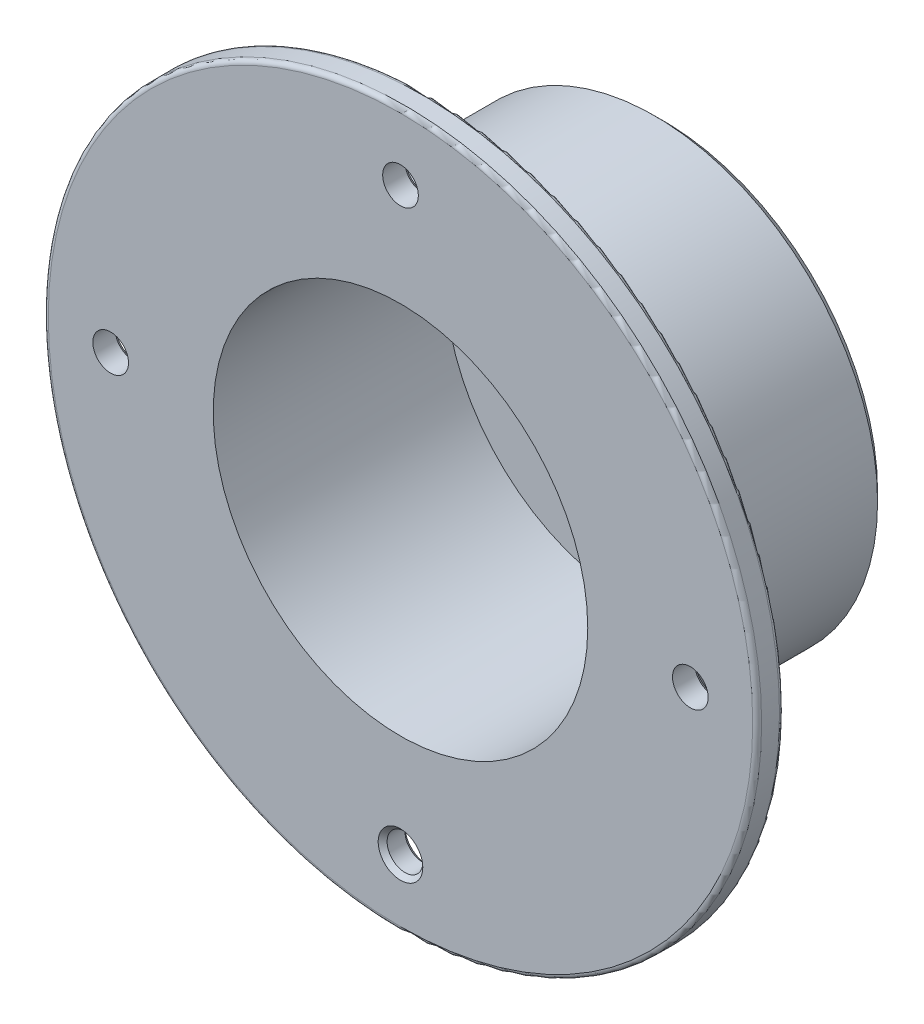
ISO-10303-21;
HEADER;
FILE_DESCRIPTION(('STEP AP214'),'2;1');
FILE_NAME('part.step','',(''),(''),'','','');
FILE_SCHEMA(('AUTOMOTIVE_DESIGN { 1 0 10303 214 1 1 1 1 }'));
ENDSEC;
DATA;
#1=APPLICATION_CONTEXT('core data for automotive mechanical design processes');
#2=APPLICATION_PROTOCOL_DEFINITION('international standard','automotive_design',2000,#1);
#3=PRODUCT_CONTEXT('',#1,'mechanical');
#4=PRODUCT('Part','Part','',(#3));
#5=PRODUCT_RELATED_PRODUCT_CATEGORY('part','',(#4));
#6=PRODUCT_DEFINITION_FORMATION('','',#4);
#7=PRODUCT_DEFINITION_CONTEXT('part definition',#1,'design');
#8=PRODUCT_DEFINITION('design','',#6,#7);
#9=PRODUCT_DEFINITION_SHAPE('','',#8);
#10=(LENGTH_UNIT() NAMED_UNIT(*) SI_UNIT(.MILLI.,.METRE.));
#11=(NAMED_UNIT(*) PLANE_ANGLE_UNIT() SI_UNIT($,.RADIAN.));
#12=(NAMED_UNIT(*) SI_UNIT($,.STERADIAN.) SOLID_ANGLE_UNIT());
#13=UNCERTAINTY_MEASURE_WITH_UNIT(LENGTH_MEASURE(1.E-05),#10,'distance_accuracy_value','');
#14=(GEOMETRIC_REPRESENTATION_CONTEXT(3) GLOBAL_UNCERTAINTY_ASSIGNED_CONTEXT((#13)) GLOBAL_UNIT_ASSIGNED_CONTEXT((#10,
#11,#12)) REPRESENTATION_CONTEXT('',''));
#15=CARTESIAN_POINT('',(0.,0.,0.));
#16=DIRECTION('',(0.,0.,1.));
#17=DIRECTION('',(1.,0.,0.));
#18=AXIS2_PLACEMENT_3D('',#15,#16,#17);
#19=CARTESIAN_POINT('',(0.,0.,29.5));
#20=DIRECTION('',(0.,0.,-1.));
#21=DIRECTION('',(-1.,0.,0.));
#22=AXIS2_PLACEMENT_3D('',#19,#20,#21);
#23=CYLINDRICAL_SURFACE('',#22,25.);
#24=CARTESIAN_POINT('',(0.,0.,25.5));
#25=DIRECTION('',(0.,0.,1.));
#26=DIRECTION('',(1.,0.,0.));
#27=AXIS2_PLACEMENT_3D('',#24,#25,#26);
#28=CIRCLE('',#27,25.);
#29=CARTESIAN_POINT('',(25.,0.,25.5));
#30=VERTEX_POINT('',#29);
#31=EDGE_CURVE('E122',#30,#30,#28,.F.);
#32=ORIENTED_EDGE('',*,*,#31,.T.);
#33=EDGE_LOOP('',(#32));
#34=FACE_BOUND('',#33,.T.);
#35=CARTESIAN_POINT('',(0.,0.,1.));
#36=DIRECTION('',(0.,0.,1.));
#37=DIRECTION('',(1.,0.,0.));
#38=AXIS2_PLACEMENT_3D('',#35,#36,#37);
#39=CIRCLE('',#38,25.);
#40=CARTESIAN_POINT('',(25.,0.,1.));
#41=VERTEX_POINT('',#40);
#42=EDGE_CURVE('E126',#41,#41,#39,.T.);
#43=ORIENTED_EDGE('',*,*,#42,.T.);
#44=EDGE_LOOP('',(#43));
#45=FACE_BOUND('',#44,.T.);
#46=ADVANCED_FACE('F40',(#34,#45),#23,.T.);
#47=CARTESIAN_POINT('',(0.,0.,0.));
#48=DIRECTION('',(0.,0.,1.));
#49=DIRECTION('',(1.,0.,0.));
#50=AXIS2_PLACEMENT_3D('',#47,#48,#49);
#51=PLANE('',#50);
#52=CARTESIAN_POINT('',(0.,0.,0.));
#53=DIRECTION('',(0.,0.,1.));
#54=DIRECTION('',(1.,0.,0.));
#55=AXIS2_PLACEMENT_3D('',#52,#53,#54);
#56=CIRCLE('',#55,24.);
#57=CARTESIAN_POINT('',(24.,0.,0.));
#58=VERTEX_POINT('',#57);
#59=EDGE_CURVE('E118',#58,#58,#56,.F.);
#60=ORIENTED_EDGE('',*,*,#59,.T.);
#61=EDGE_LOOP('',(#60));
#62=FACE_BOUND('',#61,.T.);
#63=ADVANCED_FACE('F170',(#62),#51,.F.);
#64=CARTESIAN_POINT('',(0.,0.,26.5));
#65=DIRECTION('',(0.,0.,1.));
#66=DIRECTION('',(1.,0.,0.));
#67=AXIS2_PLACEMENT_3D('',#64,#65,#66);
#68=CYLINDRICAL_SURFACE('',#67,40.);
#69=CARTESIAN_POINT('',(0.,0.,29.));
#70=DIRECTION('',(0.,0.,1.));
#71=DIRECTION('',(1.,0.,0.));
#72=AXIS2_PLACEMENT_3D('',#69,#70,#71);
#73=CIRCLE('',#72,40.);
#74=CARTESIAN_POINT('',(40.,0.,29.));
#75=VERTEX_POINT('',#74);
#76=EDGE_CURVE('E106',#75,#75,#73,.F.);
#77=ORIENTED_EDGE('',*,*,#76,.T.);
#78=EDGE_LOOP('',(#77));
#79=FACE_BOUND('',#78,.T.);
#80=CARTESIAN_POINT('',(0.,0.,27.));
#81=DIRECTION('',(0.,0.,1.));
#82=DIRECTION('',(1.,0.,0.));
#83=AXIS2_PLACEMENT_3D('',#80,#81,#82);
#84=CIRCLE('',#83,40.);
#85=CARTESIAN_POINT('',(40.,0.,27.));
#86=VERTEX_POINT('',#85);
#87=EDGE_CURVE('E110',#86,#86,#84,.T.);
#88=ORIENTED_EDGE('',*,*,#87,.T.);
#89=EDGE_LOOP('',(#88));
#90=FACE_BOUND('',#89,.T.);
#91=ADVANCED_FACE('F163',(#79,#90),#68,.T.);
#92=CARTESIAN_POINT('',(0.,0.,26.5));
#93=DIRECTION('',(0.,0.,1.));
#94=DIRECTION('',(1.,0.,0.));
#95=AXIS2_PLACEMENT_3D('',#92,#93,#94);
#96=PLANE('',#95);
#97=CARTESIAN_POINT('',(0.,-32.5,26.5));
#98=DIRECTION('',(0.,0.,1.));
#99=DIRECTION('',(1.,0.,0.));
#100=AXIS2_PLACEMENT_3D('',#97,#98,#99);
#101=CIRCLE('',#100,2.50000000000004);
#102=CARTESIAN_POINT('',(2.50000000000004,-32.5,26.5));
#103=VERTEX_POINT('',#102);
#104=EDGE_CURVE('E65',#103,#103,#101,.T.);
#105=ORIENTED_EDGE('',*,*,#104,.T.);
#106=EDGE_LOOP('',(#105));
#107=FACE_BOUND('',#106,.T.);
#108=CARTESIAN_POINT('',(32.5,-1.13779305212189E-13,26.5));
#109=DIRECTION('',(0.,0.,1.));
#110=DIRECTION('',(1.,0.,0.));
#111=AXIS2_PLACEMENT_3D('',#108,#109,#110);
#112=CIRCLE('',#111,2.50000000000004);
#113=CARTESIAN_POINT('',(35.,-1.13779305212189E-13,26.5));
#114=VERTEX_POINT('',#113);
#115=EDGE_CURVE('E69',#114,#114,#112,.T.);
#116=ORIENTED_EDGE('',*,*,#115,.T.);
#117=EDGE_LOOP('',(#116));
#118=FACE_BOUND('',#117,.T.);
#119=CARTESIAN_POINT('',(-32.5,3.40725592236992E-13,26.5));
#120=DIRECTION('',(0.,0.,1.));
#121=DIRECTION('',(1.,0.,0.));
#122=AXIS2_PLACEMENT_3D('',#119,#120,#121);
#123=CIRCLE('',#122,2.50000000000004);
#124=CARTESIAN_POINT('',(-30.,3.40725592236992E-13,26.5));
#125=VERTEX_POINT('',#124);
#126=EDGE_CURVE('E73',#125,#125,#123,.T.);
#127=ORIENTED_EDGE('',*,*,#126,.T.);
#128=EDGE_LOOP('',(#127));
#129=FACE_BOUND('',#128,.T.);
#130=CARTESIAN_POINT('',(0.,32.5,26.5));
#131=DIRECTION('',(0.,0.,1.));
#132=DIRECTION('',(1.,0.,0.));
#133=AXIS2_PLACEMENT_3D('',#130,#131,#132);
#134=CIRCLE('',#133,2.50000000000004);
#135=CARTESIAN_POINT('',(2.50000000000004,32.5,26.5));
#136=VERTEX_POINT('',#135);
#137=EDGE_CURVE('E77',#136,#136,#134,.T.);
#138=ORIENTED_EDGE('',*,*,#137,.T.);
#139=EDGE_LOOP('',(#138));
#140=FACE_BOUND('',#139,.T.);
#141=CARTESIAN_POINT('',(0.,0.,26.5));
#142=DIRECTION('',(0.,0.,1.));
#143=DIRECTION('',(1.,0.,0.));
#144=AXIS2_PLACEMENT_3D('',#141,#142,#143);
#145=CIRCLE('',#144,39.5);
#146=CARTESIAN_POINT('',(39.5,0.,26.5));
#147=VERTEX_POINT('',#146);
#148=EDGE_CURVE('E89',#147,#147,#145,.F.);
#149=ORIENTED_EDGE('',*,*,#148,.T.);
#150=EDGE_LOOP('',(#149));
#151=FACE_BOUND('',#150,.T.);
#152=CARTESIAN_POINT('',(0.,0.,26.5));
#153=DIRECTION('',(0.,0.,1.));
#154=DIRECTION('',(1.,0.,0.));
#155=AXIS2_PLACEMENT_3D('',#152,#153,#154);
#156=CIRCLE('',#155,26.);
#157=CARTESIAN_POINT('',(26.,0.,26.5));
#158=VERTEX_POINT('',#157);
#159=EDGE_CURVE('E130',#158,#158,#156,.T.);
#160=ORIENTED_EDGE('',*,*,#159,.T.);
#161=EDGE_LOOP('',(#160));
#162=FACE_BOUND('',#161,.T.);
#163=ADVANCED_FACE('F154',(#107,#118,#129,#140,#151,#162),#96,.F.);
#164=CARTESIAN_POINT('',(0.,0.,29.5));
#165=DIRECTION('',(0.,0.,1.));
#166=DIRECTION('',(1.,0.,0.));
#167=AXIS2_PLACEMENT_3D('',#164,#165,#166);
#168=PLANE('',#167);
#169=CARTESIAN_POINT('',(0.,-32.5,29.5));
#170=DIRECTION('',(0.,0.,1.));
#171=DIRECTION('',(1.,0.,0.));
#172=AXIS2_PLACEMENT_3D('',#169,#170,#171);
#173=CIRCLE('',#172,2.50000000000004);
#174=CARTESIAN_POINT('',(2.50000000000004,-32.5,29.5));
#175=VERTEX_POINT('',#174);
#176=EDGE_CURVE('E59',#175,#175,#173,.F.);
#177=ORIENTED_EDGE('',*,*,#176,.T.);
#178=EDGE_LOOP('',(#177));
#179=FACE_BOUND('',#178,.T.);
#180=CARTESIAN_POINT('',(32.5,-1.13779305212189E-13,29.5));
#181=DIRECTION('',(0.,0.,1.));
#182=DIRECTION('',(1.,0.,0.));
#183=AXIS2_PLACEMENT_3D('',#180,#181,#182);
#184=CIRCLE('',#183,2.);
#185=CARTESIAN_POINT('',(30.5,-1.13779305212189E-13,29.5));
#186=VERTEX_POINT('',#185);
#187=EDGE_CURVE('E90',#186,#186,#184,.T.);
#188=ORIENTED_EDGE('',*,*,#187,.F.);
#189=EDGE_LOOP('',(#188));
#190=FACE_BOUND('',#189,.T.);
#191=CARTESIAN_POINT('',(-32.5,3.40725592236992E-13,29.5));
#192=DIRECTION('',(0.,0.,1.));
#193=DIRECTION('',(1.,0.,0.));
#194=AXIS2_PLACEMENT_3D('',#191,#192,#193);
#195=CIRCLE('',#194,2.);
#196=CARTESIAN_POINT('',(-34.5,3.40725592236992E-13,29.5));
#197=VERTEX_POINT('',#196);
#198=EDGE_CURVE('E95',#197,#197,#195,.T.);
#199=ORIENTED_EDGE('',*,*,#198,.F.);
#200=EDGE_LOOP('',(#199));
#201=FACE_BOUND('',#200,.T.);
#202=CARTESIAN_POINT('',(0.,32.5,29.5));
#203=DIRECTION('',(0.,0.,1.));
#204=DIRECTION('',(1.,0.,0.));
#205=AXIS2_PLACEMENT_3D('',#202,#203,#204);
#206=CIRCLE('',#205,2.);
#207=CARTESIAN_POINT('',(-2.,32.5,29.5));
#208=VERTEX_POINT('',#207);
#209=EDGE_CURVE('E94',#208,#208,#206,.T.);
#210=ORIENTED_EDGE('',*,*,#209,.F.);
#211=EDGE_LOOP('',(#210));
#212=FACE_BOUND('',#211,.T.);
#213=CARTESIAN_POINT('',(0.,0.,29.5));
#214=DIRECTION('',(0.,0.,1.));
#215=DIRECTION('',(1.,0.,0.));
#216=AXIS2_PLACEMENT_3D('',#213,#214,#215);
#217=CIRCLE('',#216,39.5);
#218=CARTESIAN_POINT('',(39.5,0.,29.5));
#219=VERTEX_POINT('',#218);
#220=EDGE_CURVE('E114',#219,#219,#217,.T.);
#221=ORIENTED_EDGE('',*,*,#220,.T.);
#222=EDGE_LOOP('',(#221));
#223=FACE_BOUND('',#222,.T.);
#224=CARTESIAN_POINT('',(0.,0.,29.5));
#225=DIRECTION('',(0.,0.,1.));
#226=DIRECTION('',(1.,0.,0.));
#227=AXIS2_PLACEMENT_3D('',#224,#225,#226);
#228=CIRCLE('',#227,21.);
#229=CARTESIAN_POINT('',(21.,0.,29.5));
#230=VERTEX_POINT('',#229);
#231=EDGE_CURVE('E102',#230,#230,#228,.T.);
#232=ORIENTED_EDGE('',*,*,#231,.F.);
#233=EDGE_LOOP('',(#232));
#234=FACE_BOUND('',#233,.T.);
#235=ADVANCED_FACE('F151',(#179,#190,#201,#212,#223,#234),#168,.T.);
#236=CARTESIAN_POINT('',(0.,0.,26.5));
#237=DIRECTION('',(0.,0.,1.));
#238=DIRECTION('',(1.,0.,0.));
#239=AXIS2_PLACEMENT_3D('',#236,#237,#238);
#240=CONICAL_SURFACE('',#239,26.,0.78539816339745);
#241=ORIENTED_EDGE('',*,*,#31,.F.);
#242=EDGE_LOOP('',(#241));
#243=FACE_BOUND('',#242,.T.);
#244=ORIENTED_EDGE('',*,*,#159,.F.);
#245=EDGE_LOOP('',(#244));
#246=FACE_BOUND('',#245,.T.);
#247=ADVANCED_FACE('F153',(#243,#246),#240,.T.);
#248=CARTESIAN_POINT('',(0.,0.,1.));
#249=DIRECTION('',(0.,0.,1.));
#250=DIRECTION('',(1.,0.,0.));
#251=AXIS2_PLACEMENT_3D('',#248,#249,#250);
#252=CONICAL_SURFACE('',#251,25.,0.785398163397447);
#253=ORIENTED_EDGE('',*,*,#59,.F.);
#254=EDGE_LOOP('',(#253));
#255=FACE_BOUND('',#254,.T.);
#256=ORIENTED_EDGE('',*,*,#42,.F.);
#257=EDGE_LOOP('',(#256));
#258=FACE_BOUND('',#257,.T.);
#259=ADVANCED_FACE('F147',(#255,#258),#252,.T.);
#260=CARTESIAN_POINT('',(0.,0.,3.5));
#261=DIRECTION('',(0.,0.,1.));
#262=DIRECTION('',(1.,0.,0.));
#263=AXIS2_PLACEMENT_3D('',#260,#261,#262);
#264=CYLINDRICAL_SURFACE('',#263,21.);
#265=CARTESIAN_POINT('',(0.,0.,3.5));
#266=DIRECTION('',(0.,0.,1.));
#267=DIRECTION('',(1.,0.,0.));
#268=AXIS2_PLACEMENT_3D('',#265,#266,#267);
#269=CIRCLE('',#268,21.);
#270=CARTESIAN_POINT('',(21.,0.,3.5));
#271=VERTEX_POINT('',#270);
#272=EDGE_CURVE('E134',#271,#271,#269,.T.);
#273=CARTESIAN_POINT('',(21.,0.,3.5));
#274=CARTESIAN_POINT('',(21.,0.,3.77083333333333));
#275=CARTESIAN_POINT('',(21.,0.,4.04166666666667));
#276=CARTESIAN_POINT('',(21.,0.,4.58333333333333));
#277=CARTESIAN_POINT('',(21.,0.,4.85416666666667));
#278=CARTESIAN_POINT('',(21.,0.,5.39583333333333));
#279=CARTESIAN_POINT('',(21.,0.,5.66666666666667));
#280=CARTESIAN_POINT('',(21.,0.,6.20833333333333));
#281=CARTESIAN_POINT('',(21.,0.,6.47916666666667));
#282=CARTESIAN_POINT('',(21.,0.,7.02083333333333));
#283=CARTESIAN_POINT('',(21.,0.,7.29166666666667));
#284=CARTESIAN_POINT('',(21.,0.,7.83333333333333));
#285=CARTESIAN_POINT('',(21.,0.,8.10416666666667));
#286=CARTESIAN_POINT('',(21.,0.,8.64583333333333));
#287=CARTESIAN_POINT('',(21.,0.,8.91666666666667));
#288=CARTESIAN_POINT('',(21.,0.,9.45833333333333));
#289=CARTESIAN_POINT('',(21.,0.,9.72916666666667));
#290=CARTESIAN_POINT('',(21.,0.,10.2708333333333));
#291=CARTESIAN_POINT('',(21.,0.,10.5416666666667));
#292=CARTESIAN_POINT('',(21.,0.,11.0833333333333));
#293=CARTESIAN_POINT('',(21.,0.,11.3541666666667));
#294=CARTESIAN_POINT('',(21.,0.,11.8958333333333));
#295=CARTESIAN_POINT('',(21.,0.,12.1666666666667));
#296=CARTESIAN_POINT('',(21.,0.,12.7083333333333));
#297=CARTESIAN_POINT('',(21.,0.,12.9791666666667));
#298=CARTESIAN_POINT('',(21.,0.,13.5208333333333));
#299=CARTESIAN_POINT('',(21.,0.,13.7916666666667));
#300=CARTESIAN_POINT('',(21.,0.,14.3333333333333));
#301=CARTESIAN_POINT('',(21.,0.,14.6041666666667));
#302=CARTESIAN_POINT('',(21.,0.,15.1458333333333));
#303=CARTESIAN_POINT('',(21.,0.,15.4166666666667));
#304=CARTESIAN_POINT('',(21.,0.,15.9583333333333));
#305=CARTESIAN_POINT('',(21.,0.,16.2291666666667));
#306=CARTESIAN_POINT('',(21.,0.,16.7708333333333));
#307=CARTESIAN_POINT('',(21.,0.,17.0416666666667));
#308=CARTESIAN_POINT('',(21.,0.,17.5833333333333));
#309=CARTESIAN_POINT('',(21.,0.,17.8541666666667));
#310=CARTESIAN_POINT('',(21.,0.,18.3958333333333));
#311=CARTESIAN_POINT('',(21.,0.,18.6666666666667));
#312=CARTESIAN_POINT('',(21.,0.,19.2083333333333));
#313=CARTESIAN_POINT('',(21.,0.,19.4791666666667));
#314=CARTESIAN_POINT('',(21.,0.,20.0208333333333));
#315=CARTESIAN_POINT('',(21.,0.,20.2916666666667));
#316=CARTESIAN_POINT('',(21.,0.,20.8333333333333));
#317=CARTESIAN_POINT('',(21.,0.,21.1041666666667));
#318=CARTESIAN_POINT('',(21.,0.,21.6458333333333));
#319=CARTESIAN_POINT('',(21.,0.,21.9166666666667));
#320=CARTESIAN_POINT('',(21.,0.,22.4583333333333));
#321=CARTESIAN_POINT('',(21.,0.,22.7291666666667));
#322=CARTESIAN_POINT('',(21.,0.,23.2708333333333));
#323=CARTESIAN_POINT('',(21.,0.,23.5416666666667));
#324=CARTESIAN_POINT('',(21.,0.,24.0833333333333));
#325=CARTESIAN_POINT('',(21.,0.,24.3541666666667));
#326=CARTESIAN_POINT('',(21.,0.,24.8958333333333));
#327=CARTESIAN_POINT('',(21.,0.,25.1666666666667));
#328=CARTESIAN_POINT('',(21.,0.,25.7083333333333));
#329=CARTESIAN_POINT('',(21.,0.,25.9791666666667));
#330=CARTESIAN_POINT('',(21.,0.,26.5208333333333));
#331=CARTESIAN_POINT('',(21.,0.,26.7916666666667));
#332=CARTESIAN_POINT('',(21.,0.,27.3333333333333));
#333=CARTESIAN_POINT('',(21.,0.,27.6041666666667));
#334=CARTESIAN_POINT('',(21.,0.,28.1458333333333));
#335=CARTESIAN_POINT('',(21.,0.,28.4166666666667));
#336=CARTESIAN_POINT('',(21.,0.,28.9583333333333));
#337=CARTESIAN_POINT('',(21.,0.,29.2291666666667));
#338=CARTESIAN_POINT('',(21.,0.,29.5));
#339=B_SPLINE_CURVE_WITH_KNOTS('',3,(#273,#274,#275,#276,#277,#278,#279,#280,#281,#282,#283,
#284,#285,#286,#287,#288,#289,#290,#291,#292,#293,#294,#295,#296,#297,#298,#299,#300,#301,#302,
#303,#304,#305,#306,#307,#308,#309,#310,#311,#312,#313,#314,#315,#316,#317,#318,#319,#320,#321,
#322,#323,#324,#325,#326,#327,#328,#329,#330,#331,#332,#333,#334,#335,#336,#337,#338),
.UNSPECIFIED.,.F.,.F.,(4,2,2,2,2,2,2,2,2,2,2,2,2,2,2,2,2,2,2,2,2,2,2,2,2,2,2,2,2,2,2,2,4),(0.,
0.8125,1.625,2.4375,3.25,4.0625,4.875,5.6875,6.5,7.3125,8.125,8.9375,9.75,10.5625,11.375,
12.1875,13.,13.8125,14.625,15.4375,16.25,17.0625,17.875,18.6875,19.5,20.3125,21.125,21.9375,
22.75,23.5625,24.375,25.1875,26.),.UNSPECIFIED.);
#340=EDGE_CURVE('BSEAM144',#271,#230,#339,.T.);
#341=ORIENTED_EDGE('',*,*,#272,.F.);
#342=ORIENTED_EDGE('',*,*,#231,.T.);
#343=ORIENTED_EDGE('',*,*,#340,.T.);
#344=ORIENTED_EDGE('',*,*,#340,.F.);
#345=EDGE_LOOP('',(#341,#343,#342,#344));
#346=FACE_BOUND('',#345,.T.);
#347=ADVANCED_FACE('F144',(#346),#264,.F.);
#348=CARTESIAN_POINT('',(0.,0.,3.5));
#349=DIRECTION('',(0.,0.,1.));
#350=DIRECTION('',(1.,0.,0.));
#351=AXIS2_PLACEMENT_3D('',#348,#349,#350);
#352=PLANE('',#351);
#353=ORIENTED_EDGE('',*,*,#272,.T.);
#354=EDGE_LOOP('',(#353));
#355=FACE_BOUND('',#354,.T.);
#356=ADVANCED_FACE('F142',(#355),#352,.T.);
#357=CARTESIAN_POINT('',(0.,0.,29.));
#358=DIRECTION('',(0.,0.,1.));
#359=DIRECTION('',(1.,0.,0.));
#360=AXIS2_PLACEMENT_3D('',#357,#358,#359);
#361=TOROIDAL_SURFACE('',#360,39.5,0.5);
#362=ORIENTED_EDGE('',*,*,#76,.F.);
#363=EDGE_LOOP('',(#362));
#364=FACE_BOUND('',#363,.T.);
#365=ORIENTED_EDGE('',*,*,#220,.F.);
#366=EDGE_LOOP('',(#365));
#367=FACE_BOUND('',#366,.T.);
#368=ADVANCED_FACE('F189',(#364,#367),#361,.T.);
#369=CARTESIAN_POINT('',(0.,0.,27.));
#370=DIRECTION('',(0.,0.,1.));
#371=DIRECTION('',(1.,0.,0.));
#372=AXIS2_PLACEMENT_3D('',#369,#370,#371);
#373=TOROIDAL_SURFACE('',#372,39.5,0.5);
#374=ORIENTED_EDGE('',*,*,#148,.F.);
#375=EDGE_LOOP('',(#374));
#376=FACE_BOUND('',#375,.T.);
#377=ORIENTED_EDGE('',*,*,#87,.F.);
#378=EDGE_LOOP('',(#377));
#379=FACE_BOUND('',#378,.T.);
#380=ADVANCED_FACE('F192',(#376,#379),#373,.T.);
#381=CARTESIAN_POINT('',(0.,32.5,52.5));
#382=DIRECTION('',(0.,0.,-1.));
#383=DIRECTION('',(-1.,0.,0.));
#384=AXIS2_PLACEMENT_3D('',#381,#382,#383);
#385=CYLINDRICAL_SURFACE('',#384,2.);
#386=CARTESIAN_POINT('',(0.,32.5,27.));
#387=DIRECTION('',(0.,0.,1.));
#388=DIRECTION('',(1.,0.,0.));
#389=AXIS2_PLACEMENT_3D('',#386,#387,#388);
#390=CIRCLE('',#389,2.);
#391=CARTESIAN_POINT('',(-2.,32.5,27.));
#392=VERTEX_POINT('',#391);
#393=EDGE_CURVE('E10',#392,#392,#390,.F.);
#394=CARTESIAN_POINT('',(-2.,32.5,27.));
#395=CARTESIAN_POINT('',(-2.,32.5,27.0260416666667));
#396=CARTESIAN_POINT('',(-2.,32.5,27.0520833333334));
#397=CARTESIAN_POINT('',(-2.,32.5,27.1041666666667));
#398=CARTESIAN_POINT('',(-2.,32.5,27.1302083333334));
#399=CARTESIAN_POINT('',(-2.,32.5,27.1822916666667));
#400=CARTESIAN_POINT('',(-2.,32.5,27.2083333333334));
#401=CARTESIAN_POINT('',(-2.,32.5,27.2604166666667));
#402=CARTESIAN_POINT('',(-2.,32.5,27.2864583333334));
#403=CARTESIAN_POINT('',(-2.,32.5,27.3385416666667));
#404=CARTESIAN_POINT('',(-2.,32.5,27.3645833333334));
#405=CARTESIAN_POINT('',(-2.,32.5,27.4166666666667));
#406=CARTESIAN_POINT('',(-2.,32.5,27.4427083333334));
#407=CARTESIAN_POINT('',(-2.,32.5,27.4947916666667));
#408=CARTESIAN_POINT('',(-2.,32.5,27.5208333333334));
#409=CARTESIAN_POINT('',(-2.,32.5,27.5729166666667));
#410=CARTESIAN_POINT('',(-2.,32.5,27.5989583333334));
#411=CARTESIAN_POINT('',(-2.,32.5,27.6510416666667));
#412=CARTESIAN_POINT('',(-2.,32.5,27.6770833333334));
#413=CARTESIAN_POINT('',(-2.,32.5,27.7291666666667));
#414=CARTESIAN_POINT('',(-2.,32.5,27.7552083333334));
#415=CARTESIAN_POINT('',(-2.,32.5,27.8072916666667));
#416=CARTESIAN_POINT('',(-2.,32.5,27.8333333333334));
#417=CARTESIAN_POINT('',(-2.,32.5,27.8854166666667));
#418=CARTESIAN_POINT('',(-2.,32.5,27.9114583333334));
#419=CARTESIAN_POINT('',(-2.,32.5,27.9635416666667));
#420=CARTESIAN_POINT('',(-2.,32.5,27.9895833333334));
#421=CARTESIAN_POINT('',(-2.,32.5,28.0416666666667));
#422=CARTESIAN_POINT('',(-2.,32.5,28.0677083333333));
#423=CARTESIAN_POINT('',(-2.,32.5,28.1197916666667));
#424=CARTESIAN_POINT('',(-2.,32.5,28.1458333333333));
#425=CARTESIAN_POINT('',(-2.,32.5,28.1979166666667));
#426=CARTESIAN_POINT('',(-2.,32.5,28.2239583333333));
#427=CARTESIAN_POINT('',(-2.,32.5,28.2760416666667));
#428=CARTESIAN_POINT('',(-2.,32.5,28.3020833333333));
#429=CARTESIAN_POINT('',(-2.,32.5,28.3541666666667));
#430=CARTESIAN_POINT('',(-2.,32.5,28.3802083333333));
#431=CARTESIAN_POINT('',(-2.,32.5,28.4322916666667));
#432=CARTESIAN_POINT('',(-2.,32.5,28.4583333333333));
#433=CARTESIAN_POINT('',(-2.,32.5,28.5104166666667));
#434=CARTESIAN_POINT('',(-2.,32.5,28.5364583333333));
#435=CARTESIAN_POINT('',(-2.,32.5,28.5885416666667));
#436=CARTESIAN_POINT('',(-2.,32.5,28.6145833333333));
#437=CARTESIAN_POINT('',(-2.,32.5,28.6666666666667));
#438=CARTESIAN_POINT('',(-2.,32.5,28.6927083333333));
#439=CARTESIAN_POINT('',(-2.,32.5,28.7447916666667));
#440=CARTESIAN_POINT('',(-2.,32.5,28.7708333333333));
#441=CARTESIAN_POINT('',(-2.,32.5,28.8229166666667));
#442=CARTESIAN_POINT('',(-2.,32.5,28.8489583333333));
#443=CARTESIAN_POINT('',(-2.,32.5,28.9010416666667));
#444=CARTESIAN_POINT('',(-2.,32.5,28.9270833333333));
#445=CARTESIAN_POINT('',(-2.,32.5,28.9791666666667));
#446=CARTESIAN_POINT('',(-2.,32.5,29.0052083333333));
#447=CARTESIAN_POINT('',(-2.,32.5,29.0572916666667));
#448=CARTESIAN_POINT('',(-2.,32.5,29.0833333333333));
#449=CARTESIAN_POINT('',(-2.,32.5,29.1354166666667));
#450=CARTESIAN_POINT('',(-2.,32.5,29.1614583333333));
#451=CARTESIAN_POINT('',(-2.,32.5,29.2135416666667));
#452=CARTESIAN_POINT('',(-2.,32.5,29.2395833333333));
#453=CARTESIAN_POINT('',(-2.,32.5,29.2916666666667));
#454=CARTESIAN_POINT('',(-2.,32.5,29.3177083333333));
#455=CARTESIAN_POINT('',(-2.,32.5,29.3697916666667));
#456=CARTESIAN_POINT('',(-2.,32.5,29.3958333333333));
#457=CARTESIAN_POINT('',(-2.,32.5,29.4479166666667));
#458=CARTESIAN_POINT('',(-2.,32.5,29.4739583333333));
#459=CARTESIAN_POINT('',(-2.,32.5,29.5));
#460=B_SPLINE_CURVE_WITH_KNOTS('',3,(#394,#395,#396,#397,#398,#399,#400,#401,#402,#403,#404,
#405,#406,#407,#408,#409,#410,#411,#412,#413,#414,#415,#416,#417,#418,#419,#420,#421,#422,#423,
#424,#425,#426,#427,#428,#429,#430,#431,#432,#433,#434,#435,#436,#437,#438,#439,#440,#441,#442,
#443,#444,#445,#446,#447,#448,#449,#450,#451,#452,#453,#454,#455,#456,#457,#458,#459),
.UNSPECIFIED.,.F.,.F.,(4,2,2,2,2,2,2,2,2,2,2,2,2,2,2,2,2,2,2,2,2,2,2,2,2,2,2,2,2,2,2,2,4),(0.,
0.0781249999999983,0.156249999999997,0.234374999999995,0.312499999999993,0.390624999999995,
0.468749999999993,0.546874999999992,0.62499999999999,0.703124999999988,0.781249999999987,
0.859374999999985,0.937499999999987,1.01562499999999,1.09374999999998,1.17187499999998,
1.24999999999998,1.32812499999998,1.40624999999998,1.48437499999998,1.56249999999997,
1.64062499999998,1.71874999999997,1.79687499999997,1.87499999999997,1.95312499999997,
2.03124999999997,2.10937499999997,2.18749999999997,2.26562499999997,2.34374999999996,
2.42187499999996,2.49999999999996),.UNSPECIFIED.);
#461=EDGE_CURVE('BSEAM196',#392,#208,#460,.T.);
#462=ORIENTED_EDGE('',*,*,#393,.T.);
#463=ORIENTED_EDGE('',*,*,#209,.T.);
#464=ORIENTED_EDGE('',*,*,#461,.T.);
#465=ORIENTED_EDGE('',*,*,#461,.F.);
#466=EDGE_LOOP('',(#462,#464,#463,#465));
#467=FACE_BOUND('',#466,.T.);
#468=ADVANCED_FACE('F196',(#467),#385,.F.);
#469=CARTESIAN_POINT('',(-32.5,3.40725592236992E-13,52.5));
#470=DIRECTION('',(0.,0.,-1.));
#471=DIRECTION('',(-1.,0.,0.));
#472=AXIS2_PLACEMENT_3D('',#469,#470,#471);
#473=CYLINDRICAL_SURFACE('',#472,2.);
#474=CARTESIAN_POINT('',(-32.5,3.40725592236992E-13,27.));
#475=DIRECTION('',(0.,0.,1.));
#476=DIRECTION('',(1.,0.,0.));
#477=AXIS2_PLACEMENT_3D('',#474,#475,#476);
#478=CIRCLE('',#477,2.);
#479=CARTESIAN_POINT('',(-34.5,3.40725592236992E-13,27.));
#480=VERTEX_POINT('',#479);
#481=EDGE_CURVE('E49',#480,#480,#478,.F.);
#482=CARTESIAN_POINT('',(-34.5,3.40725592236992E-13,27.));
#483=CARTESIAN_POINT('',(-34.5,3.40725592236992E-13,27.0260416666667));
#484=CARTESIAN_POINT('',(-34.5,3.40725592236992E-13,27.0520833333334));
#485=CARTESIAN_POINT('',(-34.5,3.40725592236992E-13,27.1041666666667));
#486=CARTESIAN_POINT('',(-34.5,3.40725592236992E-13,27.1302083333334));
#487=CARTESIAN_POINT('',(-34.5,3.40725592236992E-13,27.1822916666667));
#488=CARTESIAN_POINT('',(-34.5,3.40725592236992E-13,27.2083333333334));
#489=CARTESIAN_POINT('',(-34.5,3.40725592236992E-13,27.2604166666667));
#490=CARTESIAN_POINT('',(-34.5,3.40725592236992E-13,27.2864583333334));
#491=CARTESIAN_POINT('',(-34.5,3.40725592236992E-13,27.3385416666667));
#492=CARTESIAN_POINT('',(-34.5,3.40725592236992E-13,27.3645833333334));
#493=CARTESIAN_POINT('',(-34.5,3.40725592236992E-13,27.4166666666667));
#494=CARTESIAN_POINT('',(-34.5,3.40725592236992E-13,27.4427083333334));
#495=CARTESIAN_POINT('',(-34.5,3.40725592236992E-13,27.4947916666667));
#496=CARTESIAN_POINT('',(-34.5,3.40725592236992E-13,27.5208333333334));
#497=CARTESIAN_POINT('',(-34.5,3.40725592236992E-13,27.5729166666667));
#498=CARTESIAN_POINT('',(-34.5,3.40725592236992E-13,27.5989583333334));
#499=CARTESIAN_POINT('',(-34.5,3.40725592236992E-13,27.6510416666667));
#500=CARTESIAN_POINT('',(-34.5,3.40725592236992E-13,27.6770833333334));
#501=CARTESIAN_POINT('',(-34.5,3.40725592236992E-13,27.7291666666667));
#502=CARTESIAN_POINT('',(-34.5,3.40725592236992E-13,27.7552083333334));
#503=CARTESIAN_POINT('',(-34.5,3.40725592236992E-13,27.8072916666667));
#504=CARTESIAN_POINT('',(-34.5,3.40725592236992E-13,27.8333333333334));
#505=CARTESIAN_POINT('',(-34.5,3.40725592236992E-13,27.8854166666667));
#506=CARTESIAN_POINT('',(-34.5,3.40725592236992E-13,27.9114583333334));
#507=CARTESIAN_POINT('',(-34.5,3.40725592236992E-13,27.9635416666667));
#508=CARTESIAN_POINT('',(-34.5,3.40725592236992E-13,27.9895833333334));
#509=CARTESIAN_POINT('',(-34.5,3.40725592236992E-13,28.0416666666667));
#510=CARTESIAN_POINT('',(-34.5,3.40725592236992E-13,28.0677083333333));
#511=CARTESIAN_POINT('',(-34.5,3.40725592236992E-13,28.1197916666667));
#512=CARTESIAN_POINT('',(-34.5,3.40725592236992E-13,28.1458333333333));
#513=CARTESIAN_POINT('',(-34.5,3.40725592236992E-13,28.1979166666667));
#514=CARTESIAN_POINT('',(-34.5,3.40725592236992E-13,28.2239583333333));
#515=CARTESIAN_POINT('',(-34.5,3.40725592236992E-13,28.2760416666667));
#516=CARTESIAN_POINT('',(-34.5,3.40725592236992E-13,28.3020833333333));
#517=CARTESIAN_POINT('',(-34.5,3.40725592236992E-13,28.3541666666667));
#518=CARTESIAN_POINT('',(-34.5,3.40725592236992E-13,28.3802083333333));
#519=CARTESIAN_POINT('',(-34.5,3.40725592236992E-13,28.4322916666667));
#520=CARTESIAN_POINT('',(-34.5,3.40725592236992E-13,28.4583333333333));
#521=CARTESIAN_POINT('',(-34.5,3.40725592236992E-13,28.5104166666667));
#522=CARTESIAN_POINT('',(-34.5,3.40725592236992E-13,28.5364583333333));
#523=CARTESIAN_POINT('',(-34.5,3.40725592236992E-13,28.5885416666667));
#524=CARTESIAN_POINT('',(-34.5,3.40725592236992E-13,28.6145833333333));
#525=CARTESIAN_POINT('',(-34.5,3.40725592236992E-13,28.6666666666667));
#526=CARTESIAN_POINT('',(-34.5,3.40725592236992E-13,28.6927083333333));
#527=CARTESIAN_POINT('',(-34.5,3.40725592236992E-13,28.7447916666667));
#528=CARTESIAN_POINT('',(-34.5,3.40725592236992E-13,28.7708333333333));
#529=CARTESIAN_POINT('',(-34.5,3.40725592236992E-13,28.8229166666667));
#530=CARTESIAN_POINT('',(-34.5,3.40725592236992E-13,28.8489583333333));
#531=CARTESIAN_POINT('',(-34.5,3.40725592236992E-13,28.9010416666667));
#532=CARTESIAN_POINT('',(-34.5,3.40725592236992E-13,28.9270833333333));
#533=CARTESIAN_POINT('',(-34.5,3.40725592236992E-13,28.9791666666667));
#534=CARTESIAN_POINT('',(-34.5,3.40725592236992E-13,29.0052083333333));
#535=CARTESIAN_POINT('',(-34.5,3.40725592236992E-13,29.0572916666667));
#536=CARTESIAN_POINT('',(-34.5,3.40725592236992E-13,29.0833333333333));
#537=CARTESIAN_POINT('',(-34.5,3.40725592236992E-13,29.1354166666667));
#538=CARTESIAN_POINT('',(-34.5,3.40725592236992E-13,29.1614583333333));
#539=CARTESIAN_POINT('',(-34.5,3.40725592236992E-13,29.2135416666667));
#540=CARTESIAN_POINT('',(-34.5,3.40725592236992E-13,29.2395833333333));
#541=CARTESIAN_POINT('',(-34.5,3.40725592236992E-13,29.2916666666667));
#542=CARTESIAN_POINT('',(-34.5,3.40725592236992E-13,29.3177083333333));
#543=CARTESIAN_POINT('',(-34.5,3.40725592236992E-13,29.3697916666667));
#544=CARTESIAN_POINT('',(-34.5,3.40725592236992E-13,29.3958333333333));
#545=CARTESIAN_POINT('',(-34.5,3.40725592236992E-13,29.4479166666667));
#546=CARTESIAN_POINT('',(-34.5,3.40725592236992E-13,29.4739583333333));
#547=CARTESIAN_POINT('',(-34.5,3.40725592236992E-13,29.5));
#548=B_SPLINE_CURVE_WITH_KNOTS('',3,(#482,#483,#484,#485,#486,#487,#488,#489,#490,#491,#492,
#493,#494,#495,#496,#497,#498,#499,#500,#501,#502,#503,#504,#505,#506,#507,#508,#509,#510,#511,
#512,#513,#514,#515,#516,#517,#518,#519,#520,#521,#522,#523,#524,#525,#526,#527,#528,#529,#530,
#531,#532,#533,#534,#535,#536,#537,#538,#539,#540,#541,#542,#543,#544,#545,#546,#547),
.UNSPECIFIED.,.F.,.F.,(4,2,2,2,2,2,2,2,2,2,2,2,2,2,2,2,2,2,2,2,2,2,2,2,2,2,2,2,2,2,2,2,4),(0.,
0.0781249999999983,0.156249999999997,0.234374999999995,0.312499999999993,0.390624999999995,
0.468749999999993,0.546874999999992,0.62499999999999,0.703124999999988,0.781249999999987,
0.859374999999985,0.937499999999987,1.01562499999999,1.09374999999998,1.17187499999998,
1.24999999999998,1.32812499999998,1.40624999999998,1.48437499999998,1.56249999999997,
1.64062499999998,1.71874999999997,1.79687499999997,1.87499999999997,1.95312499999997,
2.03124999999997,2.10937499999997,2.18749999999997,2.26562499999997,2.34374999999996,
2.42187499999996,2.49999999999996),.UNSPECIFIED.);
#549=EDGE_CURVE('BSEAM250',#480,#197,#548,.T.);
#550=ORIENTED_EDGE('',*,*,#481,.T.);
#551=ORIENTED_EDGE('',*,*,#198,.T.);
#552=ORIENTED_EDGE('',*,*,#549,.T.);
#553=ORIENTED_EDGE('',*,*,#549,.F.);
#554=EDGE_LOOP('',(#550,#552,#551,#553));
#555=FACE_BOUND('',#554,.T.);
#556=ADVANCED_FACE('F250',(#555),#473,.F.);
#557=CARTESIAN_POINT('',(0.,-32.5,52.5));
#558=DIRECTION('',(0.,0.,-1.));
#559=DIRECTION('',(-1.,0.,0.));
#560=AXIS2_PLACEMENT_3D('',#557,#558,#559);
#561=CYLINDRICAL_SURFACE('',#560,2.);
#562=CARTESIAN_POINT('',(0.,-32.5,27.));
#563=DIRECTION('',(0.,0.,1.));
#564=DIRECTION('',(1.,0.,0.));
#565=AXIS2_PLACEMENT_3D('',#562,#563,#564);
#566=CIRCLE('',#565,2.);
#567=CARTESIAN_POINT('',(-2.,-32.5,27.));
#568=VERTEX_POINT('',#567);
#569=EDGE_CURVE('E81',#568,#568,#566,.F.);
#570=CARTESIAN_POINT('',(0.,-32.5,29.));
#571=DIRECTION('',(0.,0.,1.));
#572=DIRECTION('',(1.,0.,0.));
#573=AXIS2_PLACEMENT_3D('',#570,#571,#572);
#574=CIRCLE('',#573,2.);
#575=CARTESIAN_POINT('',(-2.,-32.5,29.));
#576=VERTEX_POINT('',#575);
#577=EDGE_CURVE('E85',#576,#576,#574,.T.);
#578=CARTESIAN_POINT('',(-2.,-32.5,27.));
#579=CARTESIAN_POINT('',(-2.,-32.5,27.0208333333334));
#580=CARTESIAN_POINT('',(-2.,-32.5,27.0416666666667));
#581=CARTESIAN_POINT('',(-2.,-32.5,27.0833333333334));
#582=CARTESIAN_POINT('',(-2.,-32.5,27.1041666666667));
#583=CARTESIAN_POINT('',(-2.,-32.5,27.1458333333334));
#584=CARTESIAN_POINT('',(-2.,-32.5,27.1666666666667));
#585=CARTESIAN_POINT('',(-2.,-32.5,27.2083333333334));
#586=CARTESIAN_POINT('',(-2.,-32.5,27.2291666666667));
#587=CARTESIAN_POINT('',(-2.,-32.5,27.2708333333334));
#588=CARTESIAN_POINT('',(-2.,-32.5,27.2916666666667));
#589=CARTESIAN_POINT('',(-2.,-32.5,27.3333333333334));
#590=CARTESIAN_POINT('',(-2.,-32.5,27.3541666666667));
#591=CARTESIAN_POINT('',(-2.,-32.5,27.3958333333334));
#592=CARTESIAN_POINT('',(-2.,-32.5,27.4166666666667));
#593=CARTESIAN_POINT('',(-2.,-32.5,27.4583333333334));
#594=CARTESIAN_POINT('',(-2.,-32.5,27.4791666666667));
#595=CARTESIAN_POINT('',(-2.,-32.5,27.5208333333334));
#596=CARTESIAN_POINT('',(-2.,-32.5,27.5416666666667));
#597=CARTESIAN_POINT('',(-2.,-32.5,27.5833333333333));
#598=CARTESIAN_POINT('',(-2.,-32.5,27.6041666666667));
#599=CARTESIAN_POINT('',(-2.,-32.5,27.6458333333333));
#600=CARTESIAN_POINT('',(-2.,-32.5,27.6666666666667));
#601=CARTESIAN_POINT('',(-2.,-32.5,27.7083333333333));
#602=CARTESIAN_POINT('',(-2.,-32.5,27.7291666666667));
#603=CARTESIAN_POINT('',(-2.,-32.5,27.7708333333333));
#604=CARTESIAN_POINT('',(-2.,-32.5,27.7916666666667));
#605=CARTESIAN_POINT('',(-2.,-32.5,27.8333333333333));
#606=CARTESIAN_POINT('',(-2.,-32.5,27.8541666666667));
#607=CARTESIAN_POINT('',(-2.,-32.5,27.8958333333333));
#608=CARTESIAN_POINT('',(-2.,-32.5,27.9166666666667));
#609=CARTESIAN_POINT('',(-2.,-32.5,27.9583333333333));
#610=CARTESIAN_POINT('',(-2.,-32.5,27.9791666666667));
#611=CARTESIAN_POINT('',(-2.,-32.5,28.0208333333333));
#612=CARTESIAN_POINT('',(-2.,-32.5,28.0416666666667));
#613=CARTESIAN_POINT('',(-2.,-32.5,28.0833333333333));
#614=CARTESIAN_POINT('',(-2.,-32.5,28.1041666666667));
#615=CARTESIAN_POINT('',(-2.,-32.5,28.1458333333333));
#616=CARTESIAN_POINT('',(-2.,-32.5,28.1666666666667));
#617=CARTESIAN_POINT('',(-2.,-32.5,28.2083333333333));
#618=CARTESIAN_POINT('',(-2.,-32.5,28.2291666666667));
#619=CARTESIAN_POINT('',(-2.,-32.5,28.2708333333333));
#620=CARTESIAN_POINT('',(-2.,-32.5,28.2916666666667));
#621=CARTESIAN_POINT('',(-2.,-32.5,28.3333333333333));
#622=CARTESIAN_POINT('',(-2.,-32.5,28.3541666666667));
#623=CARTESIAN_POINT('',(-2.,-32.5,28.3958333333333));
#624=CARTESIAN_POINT('',(-2.,-32.5,28.4166666666667));
#625=CARTESIAN_POINT('',(-2.,-32.5,28.4583333333333));
#626=CARTESIAN_POINT('',(-2.,-32.5,28.4791666666667));
#627=CARTESIAN_POINT('',(-2.,-32.5,28.5208333333333));
#628=CARTESIAN_POINT('',(-2.,-32.5,28.5416666666667));
#629=CARTESIAN_POINT('',(-2.,-32.5,28.5833333333333));
#630=CARTESIAN_POINT('',(-2.,-32.5,28.6041666666667));
#631=CARTESIAN_POINT('',(-2.,-32.5,28.6458333333333));
#632=CARTESIAN_POINT('',(-2.,-32.5,28.6666666666667));
#633=CARTESIAN_POINT('',(-2.,-32.5,28.7083333333333));
#634=CARTESIAN_POINT('',(-2.,-32.5,28.7291666666667));
#635=CARTESIAN_POINT('',(-2.,-32.5,28.7708333333333));
#636=CARTESIAN_POINT('',(-2.,-32.5,28.7916666666666));
#637=CARTESIAN_POINT('',(-2.,-32.5,28.8333333333333));
#638=CARTESIAN_POINT('',(-2.,-32.5,28.8541666666666));
#639=CARTESIAN_POINT('',(-2.,-32.5,28.8958333333333));
#640=CARTESIAN_POINT('',(-2.,-32.5,28.9166666666666));
#641=CARTESIAN_POINT('',(-2.,-32.5,28.9583333333333));
#642=CARTESIAN_POINT('',(-2.,-32.5,28.9791666666666));
#643=CARTESIAN_POINT('',(-2.,-32.5,29.));
#644=B_SPLINE_CURVE_WITH_KNOTS('',3,(#578,#579,#580,#581,#582,#583,#584,#585,#586,#587,#588,
#589,#590,#591,#592,#593,#594,#595,#596,#597,#598,#599,#600,#601,#602,#603,#604,#605,#606,#607,
#608,#609,#610,#611,#612,#613,#614,#615,#616,#617,#618,#619,#620,#621,#622,#623,#624,#625,#626,
#627,#628,#629,#630,#631,#632,#633,#634,#635,#636,#637,#638,#639,#640,#641,#642,#643),
.UNSPECIFIED.,.F.,.F.,(4,2,2,2,2,2,2,2,2,2,2,2,2,2,2,2,2,2,2,2,2,2,2,2,2,2,2,2,2,2,2,2,4),(0.,
0.0624999999999966,0.124999999999997,0.187499999999993,0.249999999999993,0.31249999999999,
0.37499999999999,0.437499999999987,0.499999999999987,0.562499999999983,0.62499999999998,
0.68749999999998,0.749999999999976,0.812499999999976,0.874999999999973,0.937499999999973,
0.99999999999997,1.06249999999997,1.12499999999997,1.18749999999996,1.24999999999996,
1.31249999999996,1.37499999999996,1.43749999999996,1.49999999999995,1.56249999999995,
1.62499999999995,1.68749999999995,1.74999999999995,1.81249999999995,1.87499999999994,
1.93749999999994,1.99999999999994),.UNSPECIFIED.);
#645=EDGE_CURVE('BSEAM253',#568,#576,#644,.T.);
#646=ORIENTED_EDGE('',*,*,#569,.T.);
#647=ORIENTED_EDGE('',*,*,#577,.T.);
#648=ORIENTED_EDGE('',*,*,#645,.T.);
#649=ORIENTED_EDGE('',*,*,#645,.F.);
#650=EDGE_LOOP('',(#646,#648,#647,#649));
#651=FACE_BOUND('',#650,.T.);
#652=ADVANCED_FACE('F253',(#651),#561,.F.);
#653=CARTESIAN_POINT('',(32.5,-1.13779305212189E-13,52.5));
#654=DIRECTION('',(0.,0.,-1.));
#655=DIRECTION('',(-1.,0.,0.));
#656=AXIS2_PLACEMENT_3D('',#653,#654,#655);
#657=CYLINDRICAL_SURFACE('',#656,2.);
#658=CARTESIAN_POINT('',(32.5,-1.13779305212189E-13,27.));
#659=DIRECTION('',(0.,0.,1.));
#660=DIRECTION('',(1.,0.,0.));
#661=AXIS2_PLACEMENT_3D('',#658,#659,#660);
#662=CIRCLE('',#661,2.);
#663=CARTESIAN_POINT('',(30.5,-1.13779305212189E-13,27.));
#664=VERTEX_POINT('',#663);
#665=EDGE_CURVE('E54',#664,#664,#662,.F.);
#666=CARTESIAN_POINT('',(30.5,-1.13779305212189E-13,27.));
#667=CARTESIAN_POINT('',(30.5,-1.13779305212189E-13,27.0260416666667));
#668=CARTESIAN_POINT('',(30.5,-1.13779305212189E-13,27.0520833333334));
#669=CARTESIAN_POINT('',(30.5,-1.13779305212189E-13,27.1041666666667));
#670=CARTESIAN_POINT('',(30.5,-1.13779305212189E-13,27.1302083333334));
#671=CARTESIAN_POINT('',(30.5,-1.13779305212189E-13,27.1822916666667));
#672=CARTESIAN_POINT('',(30.5,-1.13779305212189E-13,27.2083333333334));
#673=CARTESIAN_POINT('',(30.5,-1.13779305212189E-13,27.2604166666667));
#674=CARTESIAN_POINT('',(30.5,-1.13779305212189E-13,27.2864583333334));
#675=CARTESIAN_POINT('',(30.5,-1.13779305212189E-13,27.3385416666667));
#676=CARTESIAN_POINT('',(30.5,-1.13779305212189E-13,27.3645833333334));
#677=CARTESIAN_POINT('',(30.5,-1.13779305212189E-13,27.4166666666667));
#678=CARTESIAN_POINT('',(30.5,-1.13779305212189E-13,27.4427083333334));
#679=CARTESIAN_POINT('',(30.5,-1.13779305212189E-13,27.4947916666667));
#680=CARTESIAN_POINT('',(30.5,-1.13779305212189E-13,27.5208333333334));
#681=CARTESIAN_POINT('',(30.5,-1.13779305212189E-13,27.5729166666667));
#682=CARTESIAN_POINT('',(30.5,-1.13779305212189E-13,27.5989583333334));
#683=CARTESIAN_POINT('',(30.5,-1.13779305212189E-13,27.6510416666667));
#684=CARTESIAN_POINT('',(30.5,-1.13779305212189E-13,27.6770833333334));
#685=CARTESIAN_POINT('',(30.5,-1.13779305212189E-13,27.7291666666667));
#686=CARTESIAN_POINT('',(30.5,-1.13779305212189E-13,27.7552083333334));
#687=CARTESIAN_POINT('',(30.5,-1.13779305212189E-13,27.8072916666667));
#688=CARTESIAN_POINT('',(30.5,-1.13779305212189E-13,27.8333333333334));
#689=CARTESIAN_POINT('',(30.5,-1.13779305212189E-13,27.8854166666667));
#690=CARTESIAN_POINT('',(30.5,-1.13779305212189E-13,27.9114583333334));
#691=CARTESIAN_POINT('',(30.5,-1.13779305212189E-13,27.9635416666667));
#692=CARTESIAN_POINT('',(30.5,-1.13779305212189E-13,27.9895833333334));
#693=CARTESIAN_POINT('',(30.5,-1.13779305212189E-13,28.0416666666667));
#694=CARTESIAN_POINT('',(30.5,-1.13779305212189E-13,28.0677083333333));
#695=CARTESIAN_POINT('',(30.5,-1.13779305212189E-13,28.1197916666667));
#696=CARTESIAN_POINT('',(30.5,-1.13779305212189E-13,28.1458333333333));
#697=CARTESIAN_POINT('',(30.5,-1.13779305212189E-13,28.1979166666667));
#698=CARTESIAN_POINT('',(30.5,-1.13779305212189E-13,28.2239583333333));
#699=CARTESIAN_POINT('',(30.5,-1.13779305212189E-13,28.2760416666667));
#700=CARTESIAN_POINT('',(30.5,-1.13779305212189E-13,28.3020833333333));
#701=CARTESIAN_POINT('',(30.5,-1.13779305212189E-13,28.3541666666667));
#702=CARTESIAN_POINT('',(30.5,-1.13779305212189E-13,28.3802083333333));
#703=CARTESIAN_POINT('',(30.5,-1.13779305212189E-13,28.4322916666667));
#704=CARTESIAN_POINT('',(30.5,-1.13779305212189E-13,28.4583333333333));
#705=CARTESIAN_POINT('',(30.5,-1.13779305212189E-13,28.5104166666667));
#706=CARTESIAN_POINT('',(30.5,-1.13779305212189E-13,28.5364583333333));
#707=CARTESIAN_POINT('',(30.5,-1.13779305212189E-13,28.5885416666667));
#708=CARTESIAN_POINT('',(30.5,-1.13779305212189E-13,28.6145833333333));
#709=CARTESIAN_POINT('',(30.5,-1.13779305212189E-13,28.6666666666667));
#710=CARTESIAN_POINT('',(30.5,-1.13779305212189E-13,28.6927083333333));
#711=CARTESIAN_POINT('',(30.5,-1.13779305212189E-13,28.7447916666667));
#712=CARTESIAN_POINT('',(30.5,-1.13779305212189E-13,28.7708333333333));
#713=CARTESIAN_POINT('',(30.5,-1.13779305212189E-13,28.8229166666667));
#714=CARTESIAN_POINT('',(30.5,-1.13779305212189E-13,28.8489583333333));
#715=CARTESIAN_POINT('',(30.5,-1.13779305212189E-13,28.9010416666667));
#716=CARTESIAN_POINT('',(30.5,-1.13779305212189E-13,28.9270833333333));
#717=CARTESIAN_POINT('',(30.5,-1.13779305212189E-13,28.9791666666667));
#718=CARTESIAN_POINT('',(30.5,-1.13779305212189E-13,29.0052083333333));
#719=CARTESIAN_POINT('',(30.5,-1.13779305212189E-13,29.0572916666667));
#720=CARTESIAN_POINT('',(30.5,-1.13779305212189E-13,29.0833333333333));
#721=CARTESIAN_POINT('',(30.5,-1.13779305212189E-13,29.1354166666667));
#722=CARTESIAN_POINT('',(30.5,-1.13779305212189E-13,29.1614583333333));
#723=CARTESIAN_POINT('',(30.5,-1.13779305212189E-13,29.2135416666667));
#724=CARTESIAN_POINT('',(30.5,-1.13779305212189E-13,29.2395833333333));
#725=CARTESIAN_POINT('',(30.5,-1.13779305212189E-13,29.2916666666667));
#726=CARTESIAN_POINT('',(30.5,-1.13779305212189E-13,29.3177083333333));
#727=CARTESIAN_POINT('',(30.5,-1.13779305212189E-13,29.3697916666667));
#728=CARTESIAN_POINT('',(30.5,-1.13779305212189E-13,29.3958333333333));
#729=CARTESIAN_POINT('',(30.5,-1.13779305212189E-13,29.4479166666667));
#730=CARTESIAN_POINT('',(30.5,-1.13779305212189E-13,29.4739583333333));
#731=CARTESIAN_POINT('',(30.5,-1.13779305212189E-13,29.5));
#732=B_SPLINE_CURVE_WITH_KNOTS('',3,(#666,#667,#668,#669,#670,#671,#672,#673,#674,#675,#676,
#677,#678,#679,#680,#681,#682,#683,#684,#685,#686,#687,#688,#689,#690,#691,#692,#693,#694,#695,
#696,#697,#698,#699,#700,#701,#702,#703,#704,#705,#706,#707,#708,#709,#710,#711,#712,#713,#714,
#715,#716,#717,#718,#719,#720,#721,#722,#723,#724,#725,#726,#727,#728,#729,#730,#731),
.UNSPECIFIED.,.F.,.F.,(4,2,2,2,2,2,2,2,2,2,2,2,2,2,2,2,2,2,2,2,2,2,2,2,2,2,2,2,2,2,2,2,4),(0.,
0.0781249999999983,0.156249999999997,0.234374999999995,0.312499999999993,0.390624999999995,
0.468749999999993,0.546874999999992,0.62499999999999,0.703124999999988,0.781249999999987,
0.859374999999985,0.937499999999987,1.01562499999999,1.09374999999998,1.17187499999998,
1.24999999999998,1.32812499999998,1.40624999999998,1.48437499999998,1.56249999999997,
1.64062499999998,1.71874999999997,1.79687499999997,1.87499999999997,1.95312499999997,
2.03124999999997,2.10937499999997,2.18749999999997,2.26562499999997,2.34374999999996,
2.42187499999996,2.49999999999996),.UNSPECIFIED.);
#733=EDGE_CURVE('BSEAM205',#664,#186,#732,.T.);
#734=ORIENTED_EDGE('',*,*,#665,.T.);
#735=ORIENTED_EDGE('',*,*,#187,.T.);
#736=ORIENTED_EDGE('',*,*,#733,.T.);
#737=ORIENTED_EDGE('',*,*,#733,.F.);
#738=EDGE_LOOP('',(#734,#736,#735,#737));
#739=FACE_BOUND('',#738,.T.);
#740=ADVANCED_FACE('F205',(#739),#657,.F.);
#741=CARTESIAN_POINT('',(0.,-32.5,27.));
#742=DIRECTION('',(0.,0.,-1.));
#743=DIRECTION('',(-1.,0.,0.));
#744=AXIS2_PLACEMENT_3D('',#741,#742,#743);
#745=CONICAL_SURFACE('',#744,2.,0.785398163397454);
#746=ORIENTED_EDGE('',*,*,#104,.F.);
#747=EDGE_LOOP('',(#746));
#748=FACE_BOUND('',#747,.T.);
#749=ORIENTED_EDGE('',*,*,#569,.F.);
#750=EDGE_LOOP('',(#749));
#751=FACE_BOUND('',#750,.T.);
#752=ADVANCED_FACE('F198',(#748,#751),#745,.F.);
#753=CARTESIAN_POINT('',(0.,-32.5,29.));
#754=DIRECTION('',(0.,0.,1.));
#755=DIRECTION('',(1.,0.,0.));
#756=AXIS2_PLACEMENT_3D('',#753,#754,#755);
#757=CONICAL_SURFACE('',#756,2.,0.785398163397468);
#758=ORIENTED_EDGE('',*,*,#176,.F.);
#759=EDGE_LOOP('',(#758));
#760=FACE_BOUND('',#759,.T.);
#761=ORIENTED_EDGE('',*,*,#577,.F.);
#762=EDGE_LOOP('',(#761));
#763=FACE_BOUND('',#762,.T.);
#764=ADVANCED_FACE('F204',(#760,#763),#757,.F.);
#765=CARTESIAN_POINT('',(32.5,-1.13779305212189E-13,27.));
#766=DIRECTION('',(0.,0.,-1.));
#767=DIRECTION('',(-1.,0.,0.));
#768=AXIS2_PLACEMENT_3D('',#765,#766,#767);
#769=CONICAL_SURFACE('',#768,2.,0.785398163397454);
#770=ORIENTED_EDGE('',*,*,#115,.F.);
#771=EDGE_LOOP('',(#770));
#772=FACE_BOUND('',#771,.T.);
#773=ORIENTED_EDGE('',*,*,#665,.F.);
#774=EDGE_LOOP('',(#773));
#775=FACE_BOUND('',#774,.T.);
#776=ADVANCED_FACE('F212',(#772,#775),#769,.F.);
#777=CARTESIAN_POINT('',(-32.5,3.40725592236992E-13,27.));
#778=DIRECTION('',(0.,0.,-1.));
#779=DIRECTION('',(-1.,0.,0.));
#780=AXIS2_PLACEMENT_3D('',#777,#778,#779);
#781=CONICAL_SURFACE('',#780,2.,0.785398163397454);
#782=ORIENTED_EDGE('',*,*,#126,.F.);
#783=EDGE_LOOP('',(#782));
#784=FACE_BOUND('',#783,.T.);
#785=ORIENTED_EDGE('',*,*,#481,.F.);
#786=EDGE_LOOP('',(#785));
#787=FACE_BOUND('',#786,.T.);
#788=ADVANCED_FACE('F218',(#784,#787),#781,.F.);
#789=CARTESIAN_POINT('',(0.,32.5,27.));
#790=DIRECTION('',(0.,0.,-1.));
#791=DIRECTION('',(-1.,0.,0.));
#792=AXIS2_PLACEMENT_3D('',#789,#790,#791);
#793=CONICAL_SURFACE('',#792,2.,0.785398163397454);
#794=ORIENTED_EDGE('',*,*,#137,.F.);
#795=EDGE_LOOP('',(#794));
#796=FACE_BOUND('',#795,.T.);
#797=ORIENTED_EDGE('',*,*,#393,.F.);
#798=EDGE_LOOP('',(#797));
#799=FACE_BOUND('',#798,.T.);
#800=ADVANCED_FACE('F43',(#796,#799),#793,.F.);
#801=CLOSED_SHELL('',(#46,#63,#91,#163,#235,#247,#259,#347,#356,#368,#380,#468,#556,#652,#740,
#752,#764,#776,#788,#800));
#802=MANIFOLD_SOLID_BREP('B2',#801);
#803=ADVANCED_BREP_SHAPE_REPRESENTATION('',(#18,#802),#14);
#804=SHAPE_DEFINITION_REPRESENTATION(#9,#803);
ENDSEC;
END-ISO-10303-21;
